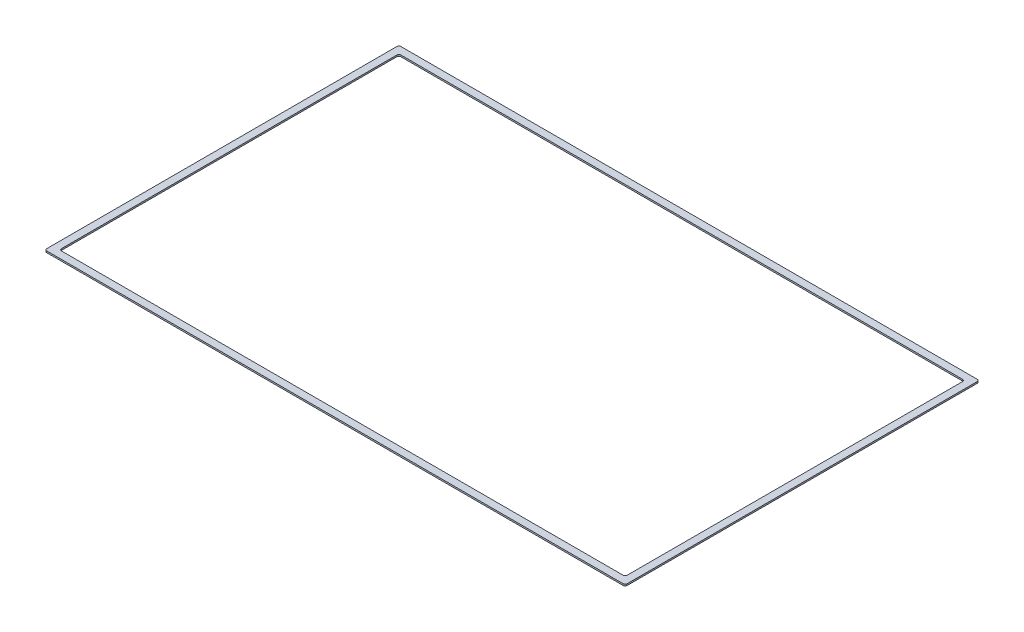
ISO-10303-21;
HEADER;
FILE_DESCRIPTION(('STEP AP214'),'2;1');
FILE_NAME('part.step','',(''),(''),'','','');
FILE_SCHEMA(('AUTOMOTIVE_DESIGN { 1 0 10303 214 1 1 1 1 }'));
ENDSEC;
DATA;
#1=APPLICATION_CONTEXT('core data for automotive mechanical design processes');
#2=APPLICATION_PROTOCOL_DEFINITION('international standard','automotive_design',2000,#1);
#3=PRODUCT_CONTEXT('',#1,'mechanical');
#4=PRODUCT('Part','Part','',(#3));
#5=PRODUCT_RELATED_PRODUCT_CATEGORY('part','',(#4));
#6=PRODUCT_DEFINITION_FORMATION('','',#4);
#7=PRODUCT_DEFINITION_CONTEXT('part definition',#1,'design');
#8=PRODUCT_DEFINITION('design','',#6,#7);
#9=PRODUCT_DEFINITION_SHAPE('','',#8);
#10=(LENGTH_UNIT() NAMED_UNIT(*) SI_UNIT(.MILLI.,.METRE.));
#11=(NAMED_UNIT(*) PLANE_ANGLE_UNIT() SI_UNIT($,.RADIAN.));
#12=(NAMED_UNIT(*) SI_UNIT($,.STERADIAN.) SOLID_ANGLE_UNIT());
#13=UNCERTAINTY_MEASURE_WITH_UNIT(LENGTH_MEASURE(1.E-05),#10,'distance_accuracy_value','');
#14=(GEOMETRIC_REPRESENTATION_CONTEXT(3) GLOBAL_UNCERTAINTY_ASSIGNED_CONTEXT((#13)) GLOBAL_UNIT_ASSIGNED_CONTEXT((#10,
#11,#12)) REPRESENTATION_CONTEXT('',''));
#15=CARTESIAN_POINT('',(0.,0.,0.));
#16=DIRECTION('',(0.,0.,1.));
#17=DIRECTION('',(1.,0.,0.));
#18=AXIS2_PLACEMENT_3D('',#15,#16,#17);
#19=CARTESIAN_POINT('',(0.,1.5,0.));
#20=DIRECTION('',(0.,1.,0.));
#21=DIRECTION('',(0.,0.,1.));
#22=AXIS2_PLACEMENT_3D('',#19,#20,#21);
#23=PLANE('',#22);
#24=DIRECTION('',(-1.,0.,0.));
#25=VECTOR('',#24,1.);
#26=CARTESIAN_POINT('',(277.,1.5,-169.));
#27=LINE('',#26,#25);
#28=CARTESIAN_POINT('',(275.,1.5,-169.));
#29=VERTEX_POINT('',#28);
#30=CARTESIAN_POINT('',(-275.,1.5,-169.));
#31=VERTEX_POINT('',#30);
#32=EDGE_CURVE('E170',#29,#31,#27,.T.);
#33=ORIENTED_EDGE('',*,*,#32,.T.);
#34=CARTESIAN_POINT('',(-275.,1.5,-167.));
#35=DIRECTION('',(0.,1.,0.));
#36=DIRECTION('',(0.,0.,1.));
#37=AXIS2_PLACEMENT_3D('',#34,#35,#36);
#38=CIRCLE('',#37,2.);
#39=CARTESIAN_POINT('',(-277.,1.5,-167.));
#40=VERTEX_POINT('',#39);
#41=EDGE_CURVE('E209',#31,#40,#38,.T.);
#42=ORIENTED_EDGE('',*,*,#41,.T.);
#43=DIRECTION('',(0.,0.,1.));
#44=VECTOR('',#43,1.);
#45=CARTESIAN_POINT('',(-277.,1.5,169.));
#46=LINE('',#45,#44);
#47=CARTESIAN_POINT('',(-277.,1.5,167.));
#48=VERTEX_POINT('',#47);
#49=EDGE_CURVE('E270',#40,#48,#46,.T.);
#50=ORIENTED_EDGE('',*,*,#49,.T.);
#51=CARTESIAN_POINT('',(-275.,1.5,167.));
#52=DIRECTION('',(0.,1.,0.));
#53=DIRECTION('',(0.,0.,1.));
#54=AXIS2_PLACEMENT_3D('',#51,#52,#53);
#55=CIRCLE('',#54,2.);
#56=CARTESIAN_POINT('',(-275.,1.5,169.));
#57=VERTEX_POINT('',#56);
#58=EDGE_CURVE('E203',#48,#57,#55,.T.);
#59=ORIENTED_EDGE('',*,*,#58,.T.);
#60=DIRECTION('',(1.,0.,0.));
#61=VECTOR('',#60,1.);
#62=CARTESIAN_POINT('',(277.,1.5,169.));
#63=LINE('',#62,#61);
#64=CARTESIAN_POINT('',(275.,1.5,169.));
#65=VERTEX_POINT('',#64);
#66=EDGE_CURVE('E273',#57,#65,#63,.T.);
#67=ORIENTED_EDGE('',*,*,#66,.T.);
#68=CARTESIAN_POINT('',(275.,1.5,167.));
#69=DIRECTION('',(0.,1.,0.));
#70=DIRECTION('',(0.,0.,1.));
#71=AXIS2_PLACEMENT_3D('',#68,#69,#70);
#72=CIRCLE('',#71,2.);
#73=CARTESIAN_POINT('',(277.,1.5,167.));
#74=VERTEX_POINT('',#73);
#75=EDGE_CURVE('E205',#65,#74,#72,.T.);
#76=ORIENTED_EDGE('',*,*,#75,.T.);
#77=DIRECTION('',(0.,0.,-1.));
#78=VECTOR('',#77,1.);
#79=CARTESIAN_POINT('',(277.,1.5,169.));
#80=LINE('',#79,#78);
#81=CARTESIAN_POINT('',(277.,1.5,-167.));
#82=VERTEX_POINT('',#81);
#83=EDGE_CURVE('E175',#74,#82,#80,.T.);
#84=ORIENTED_EDGE('',*,*,#83,.T.);
#85=CARTESIAN_POINT('',(275.,1.5,-167.));
#86=DIRECTION('',(0.,1.,0.));
#87=DIRECTION('',(0.,0.,1.));
#88=AXIS2_PLACEMENT_3D('',#85,#86,#87);
#89=CIRCLE('',#88,2.);
#90=EDGE_CURVE('E207',#82,#29,#89,.T.);
#91=ORIENTED_EDGE('',*,*,#90,.T.);
#92=EDGE_LOOP('',(#33,#42,#50,#59,#67,#76,#84,#91));
#93=FACE_BOUND('',#92,.T.);
#94=DIRECTION('',(1.,0.,0.));
#95=VECTOR('',#94,1.);
#96=CARTESIAN_POINT('',(270.,1.5,162.));
#97=LINE('',#96,#95);
#98=CARTESIAN_POINT('',(-268.,1.5,162.));
#99=VERTEX_POINT('',#98);
#100=CARTESIAN_POINT('',(268.,1.5,162.));
#101=VERTEX_POINT('',#100);
#102=EDGE_CURVE('E256',#99,#101,#97,.T.);
#103=ORIENTED_EDGE('',*,*,#102,.F.);
#104=CARTESIAN_POINT('',(-268.,1.5,160.));
#105=DIRECTION('',(0.,1.,0.));
#106=DIRECTION('',(0.,0.,1.));
#107=AXIS2_PLACEMENT_3D('',#104,#105,#106);
#108=CIRCLE('',#107,2.);
#109=CARTESIAN_POINT('',(-270.,1.5,160.));
#110=VERTEX_POINT('',#109);
#111=EDGE_CURVE('E11',#99,#110,#108,.F.);
#112=ORIENTED_EDGE('',*,*,#111,.T.);
#113=DIRECTION('',(0.,0.,1.));
#114=VECTOR('',#113,1.);
#115=CARTESIAN_POINT('',(-270.,1.5,162.));
#116=LINE('',#115,#114);
#117=CARTESIAN_POINT('',(-270.,1.5,-160.));
#118=VERTEX_POINT('',#117);
#119=EDGE_CURVE('E167',#118,#110,#116,.T.);
#120=ORIENTED_EDGE('',*,*,#119,.F.);
#121=CARTESIAN_POINT('',(-268.,1.5,-160.));
#122=DIRECTION('',(0.,1.,0.));
#123=DIRECTION('',(0.,0.,1.));
#124=AXIS2_PLACEMENT_3D('',#121,#122,#123);
#125=CIRCLE('',#124,2.);
#126=CARTESIAN_POINT('',(-268.,1.5,-162.));
#127=VERTEX_POINT('',#126);
#128=EDGE_CURVE('E158',#118,#127,#125,.F.);
#129=ORIENTED_EDGE('',*,*,#128,.T.);
#130=DIRECTION('',(-1.,0.,0.));
#131=VECTOR('',#130,1.);
#132=CARTESIAN_POINT('',(270.,1.5,-162.));
#133=LINE('',#132,#131);
#134=CARTESIAN_POINT('',(268.,1.5,-162.));
#135=VERTEX_POINT('',#134);
#136=EDGE_CURVE('E265',#135,#127,#133,.T.);
#137=ORIENTED_EDGE('',*,*,#136,.F.);
#138=CARTESIAN_POINT('',(268.,1.5,-160.));
#139=DIRECTION('',(0.,1.,0.));
#140=DIRECTION('',(0.,0.,1.));
#141=AXIS2_PLACEMENT_3D('',#138,#139,#140);
#142=CIRCLE('',#141,2.);
#143=CARTESIAN_POINT('',(270.,1.5,-160.));
#144=VERTEX_POINT('',#143);
#145=EDGE_CURVE('E50',#135,#144,#142,.F.);
#146=ORIENTED_EDGE('',*,*,#145,.T.);
#147=DIRECTION('',(0.,0.,-1.));
#148=VECTOR('',#147,1.);
#149=CARTESIAN_POINT('',(270.,1.5,162.));
#150=LINE('',#149,#148);
#151=CARTESIAN_POINT('',(270.,1.5,160.));
#152=VERTEX_POINT('',#151);
#153=EDGE_CURVE('E261',#152,#144,#150,.T.);
#154=ORIENTED_EDGE('',*,*,#153,.F.);
#155=CARTESIAN_POINT('',(268.,1.5,160.));
#156=DIRECTION('',(0.,1.,0.));
#157=DIRECTION('',(0.,0.,1.));
#158=AXIS2_PLACEMENT_3D('',#155,#156,#157);
#159=CIRCLE('',#158,2.);
#160=EDGE_CURVE('E235',#152,#101,#159,.F.);
#161=ORIENTED_EDGE('',*,*,#160,.T.);
#162=EDGE_LOOP('',(#103,#112,#120,#129,#137,#146,#154,#161));
#163=FACE_BOUND('',#162,.T.);
#164=ADVANCED_FACE('F35',(#93,#163),#23,.T.);
#165=CARTESIAN_POINT('',(0.,0.,0.));
#166=DIRECTION('',(0.,1.,0.));
#167=DIRECTION('',(0.,0.,1.));
#168=AXIS2_PLACEMENT_3D('',#165,#166,#167);
#169=PLANE('',#168);
#170=DIRECTION('',(0.,0.,1.));
#171=VECTOR('',#170,1.);
#172=CARTESIAN_POINT('',(-277.,0.,169.));
#173=LINE('',#172,#171);
#174=CARTESIAN_POINT('',(-277.,0.,-167.));
#175=VERTEX_POINT('',#174);
#176=CARTESIAN_POINT('',(-277.,0.,167.));
#177=VERTEX_POINT('',#176);
#178=EDGE_CURVE('E267',#175,#177,#173,.T.);
#179=ORIENTED_EDGE('',*,*,#178,.F.);
#180=CARTESIAN_POINT('',(-275.,0.,-167.));
#181=DIRECTION('',(0.,1.,0.));
#182=DIRECTION('',(0.,0.,1.));
#183=AXIS2_PLACEMENT_3D('',#180,#181,#182);
#184=CIRCLE('',#183,2.);
#185=CARTESIAN_POINT('',(-275.,0.,-169.));
#186=VERTEX_POINT('',#185);
#187=EDGE_CURVE('E196',#175,#186,#184,.F.);
#188=ORIENTED_EDGE('',*,*,#187,.T.);
#189=DIRECTION('',(-1.,0.,0.));
#190=VECTOR('',#189,1.);
#191=CARTESIAN_POINT('',(277.,0.,-169.));
#192=LINE('',#191,#190);
#193=CARTESIAN_POINT('',(275.,0.,-169.));
#194=VERTEX_POINT('',#193);
#195=EDGE_CURVE('E178',#194,#186,#192,.T.);
#196=ORIENTED_EDGE('',*,*,#195,.F.);
#197=CARTESIAN_POINT('',(275.,0.,-167.));
#198=DIRECTION('',(0.,1.,0.));
#199=DIRECTION('',(0.,0.,1.));
#200=AXIS2_PLACEMENT_3D('',#197,#198,#199);
#201=CIRCLE('',#200,2.);
#202=CARTESIAN_POINT('',(277.,0.,-167.));
#203=VERTEX_POINT('',#202);
#204=EDGE_CURVE('E194',#194,#203,#201,.F.);
#205=ORIENTED_EDGE('',*,*,#204,.T.);
#206=DIRECTION('',(0.,0.,-1.));
#207=VECTOR('',#206,1.);
#208=CARTESIAN_POINT('',(277.,0.,169.));
#209=LINE('',#208,#207);
#210=CARTESIAN_POINT('',(277.,0.,167.));
#211=VERTEX_POINT('',#210);
#212=EDGE_CURVE('E282',#211,#203,#209,.T.);
#213=ORIENTED_EDGE('',*,*,#212,.F.);
#214=CARTESIAN_POINT('',(275.,0.,167.));
#215=DIRECTION('',(0.,1.,0.));
#216=DIRECTION('',(0.,0.,1.));
#217=AXIS2_PLACEMENT_3D('',#214,#215,#216);
#218=CIRCLE('',#217,2.);
#219=CARTESIAN_POINT('',(275.,0.,169.));
#220=VERTEX_POINT('',#219);
#221=EDGE_CURVE('E192',#211,#220,#218,.F.);
#222=ORIENTED_EDGE('',*,*,#221,.T.);
#223=DIRECTION('',(1.,0.,0.));
#224=VECTOR('',#223,1.);
#225=CARTESIAN_POINT('',(277.,0.,169.));
#226=LINE('',#225,#224);
#227=CARTESIAN_POINT('',(-275.,0.,169.));
#228=VERTEX_POINT('',#227);
#229=EDGE_CURVE('E280',#228,#220,#226,.T.);
#230=ORIENTED_EDGE('',*,*,#229,.F.);
#231=CARTESIAN_POINT('',(-275.,0.,167.));
#232=DIRECTION('',(0.,1.,0.));
#233=DIRECTION('',(0.,0.,1.));
#234=AXIS2_PLACEMENT_3D('',#231,#232,#233);
#235=CIRCLE('',#234,2.);
#236=EDGE_CURVE('E190',#228,#177,#235,.F.);
#237=ORIENTED_EDGE('',*,*,#236,.T.);
#238=EDGE_LOOP('',(#179,#188,#196,#205,#213,#222,#230,#237));
#239=FACE_BOUND('',#238,.T.);
#240=DIRECTION('',(-1.,0.,0.));
#241=VECTOR('',#240,1.);
#242=CARTESIAN_POINT('',(270.,0.,-162.));
#243=LINE('',#242,#241);
#244=CARTESIAN_POINT('',(268.,0.,-162.));
#245=VERTEX_POINT('',#244);
#246=CARTESIAN_POINT('',(-268.,0.,-162.));
#247=VERTEX_POINT('',#246);
#248=EDGE_CURVE('E152',#245,#247,#243,.T.);
#249=ORIENTED_EDGE('',*,*,#248,.T.);
#250=CARTESIAN_POINT('',(-268.,0.,-160.));
#251=DIRECTION('',(0.,1.,0.));
#252=DIRECTION('',(0.,0.,1.));
#253=AXIS2_PLACEMENT_3D('',#250,#251,#252);
#254=CIRCLE('',#253,2.);
#255=CARTESIAN_POINT('',(-270.,0.,-160.));
#256=VERTEX_POINT('',#255);
#257=EDGE_CURVE('E229',#247,#256,#254,.T.);
#258=ORIENTED_EDGE('',*,*,#257,.T.);
#259=DIRECTION('',(0.,0.,1.));
#260=VECTOR('',#259,1.);
#261=CARTESIAN_POINT('',(-270.,0.,162.));
#262=LINE('',#261,#260);
#263=CARTESIAN_POINT('',(-270.,0.,160.));
#264=VERTEX_POINT('',#263);
#265=EDGE_CURVE('E241',#256,#264,#262,.T.);
#266=ORIENTED_EDGE('',*,*,#265,.T.);
#267=CARTESIAN_POINT('',(-268.,0.,160.));
#268=DIRECTION('',(0.,1.,0.));
#269=DIRECTION('',(0.,0.,1.));
#270=AXIS2_PLACEMENT_3D('',#267,#268,#269);
#271=CIRCLE('',#270,2.);
#272=CARTESIAN_POINT('',(-268.,0.,162.));
#273=VERTEX_POINT('',#272);
#274=EDGE_CURVE('E43',#264,#273,#271,.T.);
#275=ORIENTED_EDGE('',*,*,#274,.T.);
#276=DIRECTION('',(1.,0.,0.));
#277=VECTOR('',#276,1.);
#278=CARTESIAN_POINT('',(270.,0.,162.));
#279=LINE('',#278,#277);
#280=CARTESIAN_POINT('',(268.,0.,162.));
#281=VERTEX_POINT('',#280);
#282=EDGE_CURVE('E239',#273,#281,#279,.T.);
#283=ORIENTED_EDGE('',*,*,#282,.T.);
#284=CARTESIAN_POINT('',(268.,0.,160.));
#285=DIRECTION('',(0.,1.,0.));
#286=DIRECTION('',(0.,0.,1.));
#287=AXIS2_PLACEMENT_3D('',#284,#285,#286);
#288=CIRCLE('',#287,2.);
#289=CARTESIAN_POINT('',(270.,0.,160.));
#290=VERTEX_POINT('',#289);
#291=EDGE_CURVE('E233',#281,#290,#288,.T.);
#292=ORIENTED_EDGE('',*,*,#291,.T.);
#293=DIRECTION('',(0.,0.,-1.));
#294=VECTOR('',#293,1.);
#295=CARTESIAN_POINT('',(270.,0.,162.));
#296=LINE('',#295,#294);
#297=CARTESIAN_POINT('',(270.,0.,-160.));
#298=VERTEX_POINT('',#297);
#299=EDGE_CURVE('E153',#290,#298,#296,.T.);
#300=ORIENTED_EDGE('',*,*,#299,.T.);
#301=CARTESIAN_POINT('',(268.,0.,-160.));
#302=DIRECTION('',(0.,1.,0.));
#303=DIRECTION('',(0.,0.,1.));
#304=AXIS2_PLACEMENT_3D('',#301,#302,#303);
#305=CIRCLE('',#304,2.);
#306=EDGE_CURVE('E149',#298,#245,#305,.T.);
#307=ORIENTED_EDGE('',*,*,#306,.T.);
#308=EDGE_LOOP('',(#249,#258,#266,#275,#283,#292,#300,#307));
#309=FACE_BOUND('',#308,.T.);
#310=ADVANCED_FACE('F151',(#239,#309),#169,.F.);
#311=CARTESIAN_POINT('',(-277.,1.5,169.));
#312=DIRECTION('',(1.,0.,0.));
#313=DIRECTION('',(0.,0.,-1.));
#314=AXIS2_PLACEMENT_3D('',#311,#312,#313);
#315=PLANE('',#314);
#316=ORIENTED_EDGE('',*,*,#49,.F.);
#317=DIRECTION('',(0.,-1.,0.));
#318=VECTOR('',#317,1.);
#319=CARTESIAN_POINT('',(-277.,1.5,-167.));
#320=LINE('',#319,#318);
#321=EDGE_CURVE('E187',#40,#175,#320,.T.);
#322=ORIENTED_EDGE('',*,*,#321,.T.);
#323=ORIENTED_EDGE('',*,*,#178,.T.);
#324=DIRECTION('',(0.,-1.,0.));
#325=VECTOR('',#324,1.);
#326=CARTESIAN_POINT('',(-277.,1.5,167.));
#327=LINE('',#326,#325);
#328=EDGE_CURVE('E185',#177,#48,#327,.F.);
#329=ORIENTED_EDGE('',*,*,#328,.T.);
#330=EDGE_LOOP('',(#316,#322,#323,#329));
#331=FACE_BOUND('',#330,.T.);
#332=ADVANCED_FACE('F303',(#331),#315,.F.);
#333=CARTESIAN_POINT('',(277.,1.5,169.));
#334=DIRECTION('',(0.,0.,-1.));
#335=DIRECTION('',(-1.,0.,0.));
#336=AXIS2_PLACEMENT_3D('',#333,#334,#335);
#337=PLANE('',#336);
#338=ORIENTED_EDGE('',*,*,#229,.T.);
#339=DIRECTION('',(0.,-1.,0.));
#340=VECTOR('',#339,1.);
#341=CARTESIAN_POINT('',(275.,1.5,169.));
#342=LINE('',#341,#340);
#343=EDGE_CURVE('E227',#220,#65,#342,.F.);
#344=ORIENTED_EDGE('',*,*,#343,.T.);
#345=ORIENTED_EDGE('',*,*,#66,.F.);
#346=DIRECTION('',(0.,-1.,0.));
#347=VECTOR('',#346,1.);
#348=CARTESIAN_POINT('',(-275.,1.5,169.));
#349=LINE('',#348,#347);
#350=EDGE_CURVE('E224',#57,#228,#349,.T.);
#351=ORIENTED_EDGE('',*,*,#350,.T.);
#352=EDGE_LOOP('',(#338,#344,#345,#351));
#353=FACE_BOUND('',#352,.T.);
#354=ADVANCED_FACE('F311',(#353),#337,.F.);
#355=CARTESIAN_POINT('',(277.,1.5,169.));
#356=DIRECTION('',(-1.,0.,0.));
#357=DIRECTION('',(0.,0.,1.));
#358=AXIS2_PLACEMENT_3D('',#355,#356,#357);
#359=PLANE('',#358);
#360=ORIENTED_EDGE('',*,*,#212,.T.);
#361=DIRECTION('',(0.,-1.,0.));
#362=VECTOR('',#361,1.);
#363=CARTESIAN_POINT('',(277.,1.5,-167.));
#364=LINE('',#363,#362);
#365=EDGE_CURVE('E217',#203,#82,#364,.F.);
#366=ORIENTED_EDGE('',*,*,#365,.T.);
#367=ORIENTED_EDGE('',*,*,#83,.F.);
#368=DIRECTION('',(0.,-1.,0.));
#369=VECTOR('',#368,1.);
#370=CARTESIAN_POINT('',(277.,1.5,167.));
#371=LINE('',#370,#369);
#372=EDGE_CURVE('E214',#74,#211,#371,.T.);
#373=ORIENTED_EDGE('',*,*,#372,.T.);
#374=EDGE_LOOP('',(#360,#366,#367,#373));
#375=FACE_BOUND('',#374,.T.);
#376=ADVANCED_FACE('F319',(#375),#359,.F.);
#377=CARTESIAN_POINT('',(277.,1.5,-169.));
#378=DIRECTION('',(0.,0.,1.));
#379=DIRECTION('',(1.,0.,0.));
#380=AXIS2_PLACEMENT_3D('',#377,#378,#379);
#381=PLANE('',#380);
#382=ORIENTED_EDGE('',*,*,#195,.T.);
#383=DIRECTION('',(0.,-1.,0.));
#384=VECTOR('',#383,1.);
#385=CARTESIAN_POINT('',(-275.,1.5,-169.));
#386=LINE('',#385,#384);
#387=EDGE_CURVE('E201',#186,#31,#386,.F.);
#388=ORIENTED_EDGE('',*,*,#387,.T.);
#389=ORIENTED_EDGE('',*,*,#32,.F.);
#390=DIRECTION('',(0.,-1.,0.));
#391=VECTOR('',#390,1.);
#392=CARTESIAN_POINT('',(275.,1.5,-169.));
#393=LINE('',#392,#391);
#394=EDGE_CURVE('E198',#29,#194,#393,.T.);
#395=ORIENTED_EDGE('',*,*,#394,.T.);
#396=EDGE_LOOP('',(#382,#388,#389,#395));
#397=FACE_BOUND('',#396,.T.);
#398=ADVANCED_FACE('F291',(#397),#381,.F.);
#399=CARTESIAN_POINT('',(-270.,1.5,162.));
#400=DIRECTION('',(1.,0.,0.));
#401=DIRECTION('',(0.,0.,-1.));
#402=AXIS2_PLACEMENT_3D('',#399,#400,#401);
#403=PLANE('',#402);
#404=ORIENTED_EDGE('',*,*,#265,.F.);
#405=DIRECTION('',(0.,-1.,0.));
#406=VECTOR('',#405,1.);
#407=CARTESIAN_POINT('',(-270.,1.5,-160.));
#408=LINE('',#407,#406);
#409=EDGE_CURVE('E183',#256,#118,#408,.F.);
#410=ORIENTED_EDGE('',*,*,#409,.T.);
#411=ORIENTED_EDGE('',*,*,#119,.T.);
#412=DIRECTION('',(0.,-1.,0.));
#413=VECTOR('',#412,1.);
#414=CARTESIAN_POINT('',(-270.,0.,160.));
#415=LINE('',#414,#413);
#416=EDGE_CURVE('E172',#110,#264,#415,.T.);
#417=ORIENTED_EDGE('',*,*,#416,.T.);
#418=EDGE_LOOP('',(#404,#410,#411,#417));
#419=FACE_BOUND('',#418,.T.);
#420=ADVANCED_FACE('F258',(#419),#403,.T.);
#421=CARTESIAN_POINT('',(270.,1.5,162.));
#422=DIRECTION('',(0.,0.,-1.));
#423=DIRECTION('',(-1.,0.,0.));
#424=AXIS2_PLACEMENT_3D('',#421,#422,#423);
#425=PLANE('',#424);
#426=ORIENTED_EDGE('',*,*,#102,.T.);
#427=DIRECTION('',(0.,-1.,0.));
#428=VECTOR('',#427,1.);
#429=CARTESIAN_POINT('',(268.,0.,162.));
#430=LINE('',#429,#428);
#431=EDGE_CURVE('E221',#101,#281,#430,.T.);
#432=ORIENTED_EDGE('',*,*,#431,.T.);
#433=ORIENTED_EDGE('',*,*,#282,.F.);
#434=DIRECTION('',(0.,-1.,0.));
#435=VECTOR('',#434,1.);
#436=CARTESIAN_POINT('',(-268.,1.5,162.));
#437=LINE('',#436,#435);
#438=EDGE_CURVE('E219',#273,#99,#437,.F.);
#439=ORIENTED_EDGE('',*,*,#438,.T.);
#440=EDGE_LOOP('',(#426,#432,#433,#439));
#441=FACE_BOUND('',#440,.T.);
#442=ADVANCED_FACE('F247',(#441),#425,.T.);
#443=CARTESIAN_POINT('',(270.,1.5,162.));
#444=DIRECTION('',(-1.,0.,0.));
#445=DIRECTION('',(0.,0.,1.));
#446=AXIS2_PLACEMENT_3D('',#443,#444,#445);
#447=PLANE('',#446);
#448=ORIENTED_EDGE('',*,*,#153,.T.);
#449=DIRECTION('',(0.,-1.,0.));
#450=VECTOR('',#449,1.);
#451=CARTESIAN_POINT('',(270.,0.,-160.));
#452=LINE('',#451,#450);
#453=EDGE_CURVE('E212',#144,#298,#452,.T.);
#454=ORIENTED_EDGE('',*,*,#453,.T.);
#455=ORIENTED_EDGE('',*,*,#299,.F.);
#456=DIRECTION('',(0.,-1.,0.));
#457=VECTOR('',#456,1.);
#458=CARTESIAN_POINT('',(270.,1.5,160.));
#459=LINE('',#458,#457);
#460=EDGE_CURVE('E57',#290,#152,#459,.F.);
#461=ORIENTED_EDGE('',*,*,#460,.T.);
#462=EDGE_LOOP('',(#448,#454,#455,#461));
#463=FACE_BOUND('',#462,.T.);
#464=ADVANCED_FACE('F408',(#463),#447,.T.);
#465=CARTESIAN_POINT('',(270.,1.5,-162.));
#466=DIRECTION('',(0.,0.,1.));
#467=DIRECTION('',(1.,0.,0.));
#468=AXIS2_PLACEMENT_3D('',#465,#466,#467);
#469=PLANE('',#468);
#470=ORIENTED_EDGE('',*,*,#136,.T.);
#471=DIRECTION('',(0.,-1.,0.));
#472=VECTOR('',#471,1.);
#473=CARTESIAN_POINT('',(-268.,0.,-162.));
#474=LINE('',#473,#472);
#475=EDGE_CURVE('E166',#127,#247,#474,.T.);
#476=ORIENTED_EDGE('',*,*,#475,.T.);
#477=ORIENTED_EDGE('',*,*,#248,.F.);
#478=DIRECTION('',(0.,-1.,0.));
#479=VECTOR('',#478,1.);
#480=CARTESIAN_POINT('',(268.,1.5,-162.));
#481=LINE('',#480,#479);
#482=EDGE_CURVE('E164',#245,#135,#481,.F.);
#483=ORIENTED_EDGE('',*,*,#482,.T.);
#484=EDGE_LOOP('',(#470,#476,#477,#483));
#485=FACE_BOUND('',#484,.T.);
#486=ADVANCED_FACE('F163',(#485),#469,.T.);
#487=CARTESIAN_POINT('',(-268.,1.5,-160.));
#488=DIRECTION('',(0.,1.,0.));
#489=DIRECTION('',(0.,0.,1.));
#490=AXIS2_PLACEMENT_3D('',#487,#488,#489);
#491=CYLINDRICAL_SURFACE('',#490,2.);
#492=ORIENTED_EDGE('',*,*,#128,.F.);
#493=ORIENTED_EDGE('',*,*,#409,.F.);
#494=ORIENTED_EDGE('',*,*,#257,.F.);
#495=ORIENTED_EDGE('',*,*,#475,.F.);
#496=EDGE_LOOP('',(#492,#493,#494,#495));
#497=FACE_BOUND('',#496,.T.);
#498=ADVANCED_FACE('F338',(#497),#491,.F.);
#499=CARTESIAN_POINT('',(-275.,1.5,-167.));
#500=DIRECTION('',(0.,-1.,0.));
#501=DIRECTION('',(0.,0.,-1.));
#502=AXIS2_PLACEMENT_3D('',#499,#500,#501);
#503=CYLINDRICAL_SURFACE('',#502,2.);
#504=ORIENTED_EDGE('',*,*,#41,.F.);
#505=ORIENTED_EDGE('',*,*,#387,.F.);
#506=ORIENTED_EDGE('',*,*,#187,.F.);
#507=ORIENTED_EDGE('',*,*,#321,.F.);
#508=EDGE_LOOP('',(#504,#505,#506,#507));
#509=FACE_BOUND('',#508,.T.);
#510=ADVANCED_FACE('F297',(#509),#503,.T.);
#511=CARTESIAN_POINT('',(268.,1.5,-160.));
#512=DIRECTION('',(0.,1.,0.));
#513=DIRECTION('',(0.,0.,1.));
#514=AXIS2_PLACEMENT_3D('',#511,#512,#513);
#515=CYLINDRICAL_SURFACE('',#514,2.);
#516=ORIENTED_EDGE('',*,*,#145,.F.);
#517=ORIENTED_EDGE('',*,*,#482,.F.);
#518=ORIENTED_EDGE('',*,*,#306,.F.);
#519=ORIENTED_EDGE('',*,*,#453,.F.);
#520=EDGE_LOOP('',(#516,#517,#518,#519));
#521=FACE_BOUND('',#520,.T.);
#522=ADVANCED_FACE('F169',(#521),#515,.F.);
#523=CARTESIAN_POINT('',(275.,1.5,-167.));
#524=DIRECTION('',(0.,-1.,0.));
#525=DIRECTION('',(0.,0.,-1.));
#526=AXIS2_PLACEMENT_3D('',#523,#524,#525);
#527=CYLINDRICAL_SURFACE('',#526,2.);
#528=ORIENTED_EDGE('',*,*,#90,.F.);
#529=ORIENTED_EDGE('',*,*,#365,.F.);
#530=ORIENTED_EDGE('',*,*,#204,.F.);
#531=ORIENTED_EDGE('',*,*,#394,.F.);
#532=EDGE_LOOP('',(#528,#529,#530,#531));
#533=FACE_BOUND('',#532,.T.);
#534=ADVANCED_FACE('F321',(#533),#527,.T.);
#535=CARTESIAN_POINT('',(268.,1.5,160.));
#536=DIRECTION('',(0.,1.,0.));
#537=DIRECTION('',(0.,0.,1.));
#538=AXIS2_PLACEMENT_3D('',#535,#536,#537);
#539=CYLINDRICAL_SURFACE('',#538,2.);
#540=ORIENTED_EDGE('',*,*,#160,.F.);
#541=ORIENTED_EDGE('',*,*,#460,.F.);
#542=ORIENTED_EDGE('',*,*,#291,.F.);
#543=ORIENTED_EDGE('',*,*,#431,.F.);
#544=EDGE_LOOP('',(#540,#541,#542,#543));
#545=FACE_BOUND('',#544,.T.);
#546=ADVANCED_FACE('F348',(#545),#539,.F.);
#547=CARTESIAN_POINT('',(275.,1.5,167.));
#548=DIRECTION('',(0.,-1.,0.));
#549=DIRECTION('',(0.,0.,-1.));
#550=AXIS2_PLACEMENT_3D('',#547,#548,#549);
#551=CYLINDRICAL_SURFACE('',#550,2.);
#552=ORIENTED_EDGE('',*,*,#75,.F.);
#553=ORIENTED_EDGE('',*,*,#343,.F.);
#554=ORIENTED_EDGE('',*,*,#221,.F.);
#555=ORIENTED_EDGE('',*,*,#372,.F.);
#556=EDGE_LOOP('',(#552,#553,#554,#555));
#557=FACE_BOUND('',#556,.T.);
#558=ADVANCED_FACE('F315',(#557),#551,.T.);
#559=CARTESIAN_POINT('',(-268.,1.5,160.));
#560=DIRECTION('',(0.,1.,0.));
#561=DIRECTION('',(0.,0.,1.));
#562=AXIS2_PLACEMENT_3D('',#559,#560,#561);
#563=CYLINDRICAL_SURFACE('',#562,2.);
#564=ORIENTED_EDGE('',*,*,#111,.F.);
#565=ORIENTED_EDGE('',*,*,#438,.F.);
#566=ORIENTED_EDGE('',*,*,#274,.F.);
#567=ORIENTED_EDGE('',*,*,#416,.F.);
#568=EDGE_LOOP('',(#564,#565,#566,#567));
#569=FACE_BOUND('',#568,.T.);
#570=ADVANCED_FACE('F252',(#569),#563,.F.);
#571=CARTESIAN_POINT('',(-275.,1.5,167.));
#572=DIRECTION('',(0.,-1.,0.));
#573=DIRECTION('',(0.,0.,-1.));
#574=AXIS2_PLACEMENT_3D('',#571,#572,#573);
#575=CYLINDRICAL_SURFACE('',#574,2.);
#576=ORIENTED_EDGE('',*,*,#58,.F.);
#577=ORIENTED_EDGE('',*,*,#328,.F.);
#578=ORIENTED_EDGE('',*,*,#236,.F.);
#579=ORIENTED_EDGE('',*,*,#350,.F.);
#580=EDGE_LOOP('',(#576,#577,#578,#579));
#581=FACE_BOUND('',#580,.T.);
#582=ADVANCED_FACE('F37',(#581),#575,.T.);
#583=CLOSED_SHELL('',(#164,#310,#332,#354,#376,#398,#420,#442,#464,#486,#498,#510,#522,#534,
#546,#558,#570,#582));
#584=MANIFOLD_SOLID_BREP('B2',#583);
#585=ADVANCED_BREP_SHAPE_REPRESENTATION('',(#18,#584),#14);
#586=SHAPE_DEFINITION_REPRESENTATION(#9,#585);
ENDSEC;
END-ISO-10303-21;
